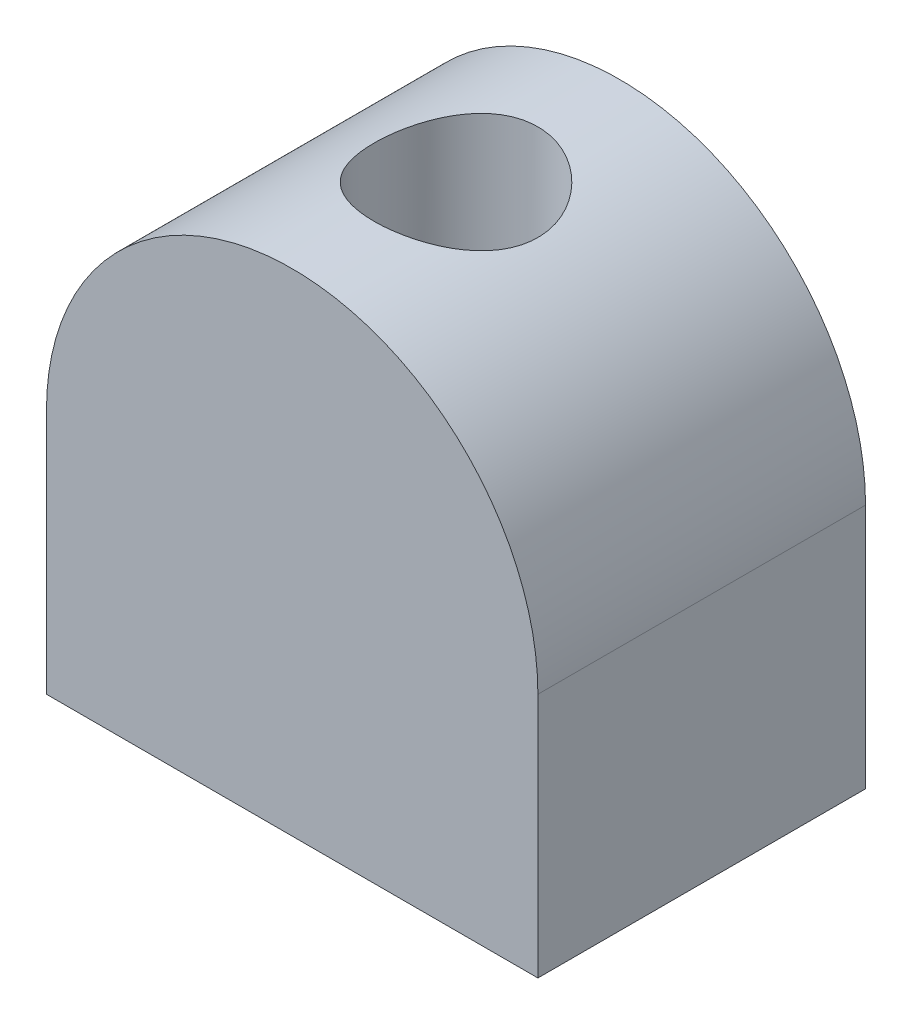
ISO-10303-21;
HEADER;
FILE_DESCRIPTION(('STEP AP214'),'2;1');
FILE_NAME('part.step','',(''),(''),'','','');
FILE_SCHEMA(('AUTOMOTIVE_DESIGN { 1 0 10303 214 1 1 1 1 }'));
ENDSEC;
DATA;
#1=APPLICATION_CONTEXT('core data for automotive mechanical design processes');
#2=APPLICATION_PROTOCOL_DEFINITION('international standard','automotive_design',2000,#1);
#3=PRODUCT_CONTEXT('',#1,'mechanical');
#4=PRODUCT('Part','Part','',(#3));
#5=PRODUCT_RELATED_PRODUCT_CATEGORY('part','',(#4));
#6=PRODUCT_DEFINITION_FORMATION('','',#4);
#7=PRODUCT_DEFINITION_CONTEXT('part definition',#1,'design');
#8=PRODUCT_DEFINITION('design','',#6,#7);
#9=PRODUCT_DEFINITION_SHAPE('','',#8);
#10=(LENGTH_UNIT() NAMED_UNIT(*) SI_UNIT(.MILLI.,.METRE.));
#11=(NAMED_UNIT(*) PLANE_ANGLE_UNIT() SI_UNIT($,.RADIAN.));
#12=(NAMED_UNIT(*) SI_UNIT($,.STERADIAN.) SOLID_ANGLE_UNIT());
#13=UNCERTAINTY_MEASURE_WITH_UNIT(LENGTH_MEASURE(1.E-05),#10,'distance_accuracy_value','');
#14=(GEOMETRIC_REPRESENTATION_CONTEXT(3) GLOBAL_UNCERTAINTY_ASSIGNED_CONTEXT((#13)) GLOBAL_UNIT_ASSIGNED_CONTEXT((#10,
#11,#12)) REPRESENTATION_CONTEXT('',''));
#15=CARTESIAN_POINT('',(0.,0.,0.));
#16=DIRECTION('',(0.,0.,1.));
#17=DIRECTION('',(1.,0.,0.));
#18=AXIS2_PLACEMENT_3D('',#15,#16,#17);
#19=CARTESIAN_POINT('',(15.,7.5,10.));
#20=DIRECTION('',(-1.,0.,0.));
#21=DIRECTION('',(0.,-1.,0.));
#22=AXIS2_PLACEMENT_3D('',#19,#20,#21);
#23=PLANE('',#22);
#24=DIRECTION('',(0.,1.,0.));
#25=VECTOR('',#24,1.);
#26=CARTESIAN_POINT('',(15.,7.5,-10.));
#27=LINE('',#26,#25);
#28=CARTESIAN_POINT('',(15.,-7.5,-10.));
#29=VERTEX_POINT('',#28);
#30=CARTESIAN_POINT('',(15.,7.5,-10.));
#31=VERTEX_POINT('',#30);
#32=EDGE_CURVE('E104',#29,#31,#27,.T.);
#33=ORIENTED_EDGE('',*,*,#32,.T.);
#34=DIRECTION('',(0.,0.,-1.));
#35=VECTOR('',#34,1.);
#36=CARTESIAN_POINT('',(15.,7.5,10.));
#37=LINE('',#36,#35);
#38=CARTESIAN_POINT('',(15.,7.5,10.));
#39=VERTEX_POINT('',#38);
#40=EDGE_CURVE('E46',#39,#31,#37,.T.);
#41=ORIENTED_EDGE('',*,*,#40,.F.);
#42=DIRECTION('',(0.,1.,0.));
#43=VECTOR('',#42,1.);
#44=CARTESIAN_POINT('',(15.,7.5,10.));
#45=LINE('',#44,#43);
#46=CARTESIAN_POINT('',(15.,-7.5,10.));
#47=VERTEX_POINT('',#46);
#48=EDGE_CURVE('E90',#47,#39,#45,.T.);
#49=ORIENTED_EDGE('',*,*,#48,.F.);
#50=DIRECTION('',(0.,0.,-1.));
#51=VECTOR('',#50,1.);
#52=CARTESIAN_POINT('',(15.,-7.5,10.));
#53=LINE('',#52,#51);
#54=EDGE_CURVE('E100',#47,#29,#53,.T.);
#55=ORIENTED_EDGE('',*,*,#54,.T.);
#56=EDGE_LOOP('',(#33,#41,#49,#55));
#57=FACE_BOUND('',#56,.T.);
#58=ADVANCED_FACE('F35',(#57),#23,.F.);
#59=CARTESIAN_POINT('',(0.,7.5,10.));
#60=DIRECTION('',(0.,0.,-1.));
#61=DIRECTION('',(-1.,0.,0.));
#62=AXIS2_PLACEMENT_3D('',#59,#60,#61);
#63=CYLINDRICAL_SURFACE('',#62,15.);
#64=CARTESIAN_POINT('',(0.,22.5,4.99999999999999));
#65=CARTESIAN_POINT('',(-0.27281681443361,22.5000007650471,5.00000126865821));
#66=CARTESIAN_POINT('',(-0.545625972692721,22.4924884753769,4.97759866936395));
#67=CARTESIAN_POINT('',(-1.08320880436489,22.4632605101644,4.88885445591386));
#68=CARTESIAN_POINT('',(-1.3479816405942,22.441543360109,4.82250828025523));
#69=CARTESIAN_POINT('',(-1.86166394750877,22.3862653953208,4.6484037830799));
#70=CARTESIAN_POINT('',(-2.11059912942976,22.3527243865376,4.5407146877042));
#71=CARTESIAN_POINT('',(-2.58687468402704,22.2772222858721,4.2872941358077));
#72=CARTESIAN_POINT('',(-2.81421078479507,22.2352595334076,4.14155517498489));
#73=CARTESIAN_POINT('',(-3.24870837510974,22.1457047221309,3.81087097570839));
#74=CARTESIAN_POINT('',(-3.45501850148552,22.0979778231161,3.62484382870571));
#75=CARTESIAN_POINT('',(-3.83416346351645,22.0030157392292,3.22116422645898));
#76=CARTESIAN_POINT('',(-4.00699092746984,21.9557806648007,3.00350482532686));
#77=CARTESIAN_POINT('',(-4.31912471111898,21.8656666235818,2.53507442404484));
#78=CARTESIAN_POINT('',(-4.45732429102251,21.8229519627198,2.28353130144921));
#79=CARTESIAN_POINT('',(-4.68909436930557,21.7487652698844,1.75911952782113));
#80=CARTESIAN_POINT('',(-4.78267848691247,21.7172898077928,1.48625741422144));
#81=CARTESIAN_POINT('',(-4.91936730756488,21.6705651637056,0.936633892488752));
#82=CARTESIAN_POINT('',(-4.96406724136036,21.6548047884339,0.660313957540239));
#83=CARTESIAN_POINT('',(-5.00670561667086,21.6397828315221,0.103681229235023));
#84=CARTESIAN_POINT('',(-5.00465850803658,21.6405161515599,-0.176630303515917));
#85=CARTESIAN_POINT('',(-4.95509951850356,21.6579507500054,-0.719683152261159));
#86=CARTESIAN_POINT('',(-4.90966956578087,21.6739207918415,-0.982642014718559));
#87=CARTESIAN_POINT('',(-4.77803081419366,21.7188328846856,-1.49696709815057));
#88=CARTESIAN_POINT('',(-4.69181713294738,21.7477764887883,-1.74833192720231));
#89=CARTESIAN_POINT('',(-4.47969529031768,21.8158955569848,-2.2370637479197));
#90=CARTESIAN_POINT('',(-4.35317024354077,21.8552282897692,-2.47414012733751));
#91=CARTESIAN_POINT('',(-4.06444553151122,21.9396279286729,-2.92435454140875));
#92=CARTESIAN_POINT('',(-3.9022355618188,21.9846964894921,-3.13748563466968));
#93=CARTESIAN_POINT('',(-3.53674666341247,22.0783664584198,-3.54545799080094));
#94=CARTESIAN_POINT('',(-3.3317657503819,22.1270294677509,-3.73876347254456));
#95=CARTESIAN_POINT('',(-2.89169784984997,22.2203469193431,-4.08865633331777));
#96=CARTESIAN_POINT('',(-2.65660797830397,22.265000976901,-4.24524019082269));
#97=CARTESIAN_POINT('',(-2.15973806523143,22.3458553968921,-4.51848150117513));
#98=CARTESIAN_POINT('',(-1.8977163820817,22.3819675004026,-4.6347274567036));
#99=CARTESIAN_POINT('',(-1.35634541682251,22.4410283572211,-4.82101586977861));
#100=CARTESIAN_POINT('',(-1.07700219077476,22.4639816827438,-4.8910743771172));
#101=CARTESIAN_POINT('',(-0.521919147646521,22.4933813535722,-4.98027833011178));
#102=CARTESIAN_POINT('',(-0.246547999324228,22.5005000916864,-5.00149904586375));
#103=CARTESIAN_POINT('',(0.303875349801193,22.4994451347413,-4.99833663200766));
#104=CARTESIAN_POINT('',(0.578927596598257,22.4912740209681,-4.97396120010061));
#105=CARTESIAN_POINT('',(1.11259933152128,22.4610012358552,-4.8819404613202));
#106=CARTESIAN_POINT('',(1.37146403417422,22.4393099355596,-4.81556896975252));
#107=CARTESIAN_POINT('',(1.87427979289787,22.3845923415035,-4.64303277766635));
#108=CARTESIAN_POINT('',(2.11822894254303,22.3515646023337,-4.53686300266107));
#109=CARTESIAN_POINT('',(2.59144148196637,22.2764465643645,-4.28464784079606));
#110=CARTESIAN_POINT('',(2.82014979608573,22.2341407377893,-4.13762703358414));
#111=CARTESIAN_POINT('',(3.25032415067793,22.1452626958131,-3.80902924993258));
#112=CARTESIAN_POINT('',(3.45178183897788,22.0986891796914,-3.62744171984117));
#113=CARTESIAN_POINT('',(3.8312625390315,22.0038423990222,-3.22510624496705));
#114=CARTESIAN_POINT('',(4.00780484622885,21.9555880543714,-3.00295386536569));
#115=CARTESIAN_POINT('',(4.32128761161787,21.8649986647354,-2.53114216094556));
#116=CARTESIAN_POINT('',(4.45822773965506,21.8226636691001,-2.28148260682961));
#117=CARTESIAN_POINT('',(4.6879846520818,21.7491195895692,-1.76163492355051));
#118=CARTESIAN_POINT('',(4.7808906608251,21.7178880396489,-1.49148960415617));
#119=CARTESIAN_POINT('',(4.91947333379677,21.6705416153225,-0.938106749779342));
#120=CARTESIAN_POINT('',(4.96517127476969,21.654419931182,-0.654875172978247));
#121=CARTESIAN_POINT('',(5.00638141238671,21.6398929437089,-0.0990145197954147));
#122=CARTESIAN_POINT('',(5.00435128654199,21.6406200128708,0.173411701434119));
#123=CARTESIAN_POINT('',(4.95621146724346,21.6575634911934,0.713825374610315));
#124=CARTESIAN_POINT('',(4.91010439729292,21.6737789784681,0.981813089775445));
#125=CARTESIAN_POINT('',(4.77685906564672,21.7192262152446,1.50067831501236));
#126=CARTESIAN_POINT('',(4.69051673007756,21.7482049011239,1.75178412502249));
#127=CARTESIAN_POINT('',(4.47989682879873,21.8158199409234,2.23613703469135));
#128=CARTESIAN_POINT('',(4.35561084276902,21.8544584381697,2.46938015594004));
#129=CARTESIAN_POINT('',(4.06630346291714,21.9391414613023,2.92241834961456));
#130=CARTESIAN_POINT('',(3.8997412138229,21.9854355821069,3.14118250949193));
#131=CARTESIAN_POINT('',(3.53321441567824,22.0791678141626,3.548449066921));
#132=CARTESIAN_POINT('',(3.3332404222574,22.1266062456186,3.73694287844037));
#133=CARTESIAN_POINT('',(2.89620778460343,22.2195015262772,4.08572206144589));
#134=CARTESIAN_POINT('',(2.65800756749864,22.2648090900628,4.244621738755));
#135=CARTESIAN_POINT('',(2.15678678703312,22.3462995586306,4.51995214425323));
#136=CARTESIAN_POINT('',(1.89377259066174,22.3824847953965,4.63639372961021));
#137=CARTESIAN_POINT('',(1.36246823600487,22.4402757534271,4.81860816244336));
#138=CARTESIAN_POINT('',(1.09493878838204,22.4624606211261,4.88641233131688));
#139=CARTESIAN_POINT('',(0.55160208005123,22.4923203532111,4.97710140338562));
#140=CARTESIAN_POINT('',(0.275797127843722,22.4999992265953,4.99999871748267));
#141=CARTESIAN_POINT('',(0.,22.5,4.99999999999999));
#142=B_SPLINE_CURVE_WITH_KNOTS('',3,(#64,#65,#66,#67,#68,#69,#70,#71,#72,#73,#74,#75,#76,#77,
#78,#79,#80,#81,#82,#83,#84,#85,#86,#87,#88,#89,#90,#91,#92,#93,#94,#95,#96,#97,#98,#99,#100,
#101,#102,#103,#104,#105,#106,#107,#108,#109,#110,#111,#112,#113,#114,#115,#116,#117,#118,#119,
#120,#121,#122,#123,#124,#125,#126,#127,#128,#129,#130,#131,#132,#133,#134,#135,#136,#137,#138,
#139,#140,#141),.UNSPECIFIED.,.T.,.F.,(4,2,2,2,2,2,2,2,2,2,2,2,2,2,2,2,2,2,2,2,2,2,2,2,2,2,2,2,
2,2,2,2,2,2,2,2,2,2,4),(0.,0.817435530130054,1.6349559263376,2.45111336435137,3.2674318889955,
4.1092342141378,4.95122166437651,5.8174192411892,6.68335223467749,7.52009628712783,
8.35658169941009,9.15484132763712,9.9531965428806,10.764408557863,11.5758551280169,
12.4296652906748,13.2835572984374,14.1459202826244,15.0079834439669,15.832679158865,
16.6572356583153,17.4579078990172,18.2586822643117,19.0805199922933,19.902609041201,
20.7620511441441,21.6215004118563,22.479200691445,23.3365142353985,24.1497833033194,
24.9630039676752,25.7607793541274,26.5587319089054,27.3915033346967,28.2245105562954,
29.0899830418615,29.9552340577293,30.7818279187971,31.6081933020135),.UNSPECIFIED.);
#143=CARTESIAN_POINT('',(0.,22.5,4.99999999999999));
#144=VERTEX_POINT('',#143);
#145=EDGE_CURVE('E11',#144,#144,#142,.T.);
#146=ORIENTED_EDGE('',*,*,#145,.T.);
#147=EDGE_LOOP('',(#146));
#148=FACE_BOUND('',#147,.T.);
#149=CARTESIAN_POINT('',(0.,7.5,-10.));
#150=DIRECTION('',(0.,0.,1.));
#151=DIRECTION('',(1.,0.,0.));
#152=AXIS2_PLACEMENT_3D('',#149,#150,#151);
#153=CIRCLE('',#152,15.);
#154=CARTESIAN_POINT('',(-15.,7.5,-10.));
#155=VERTEX_POINT('',#154);
#156=EDGE_CURVE('E95',#31,#155,#153,.T.);
#157=ORIENTED_EDGE('',*,*,#156,.T.);
#158=DIRECTION('',(0.,0.,-1.));
#159=VECTOR('',#158,1.);
#160=CARTESIAN_POINT('',(-15.,7.5,10.));
#161=LINE('',#160,#159);
#162=CARTESIAN_POINT('',(-15.,7.5,10.));
#163=VERTEX_POINT('',#162);
#164=EDGE_CURVE('E93',#163,#155,#161,.T.);
#165=ORIENTED_EDGE('',*,*,#164,.F.);
#166=CARTESIAN_POINT('',(0.,7.5,10.));
#167=DIRECTION('',(0.,0.,1.));
#168=DIRECTION('',(1.,0.,0.));
#169=AXIS2_PLACEMENT_3D('',#166,#167,#168);
#170=CIRCLE('',#169,15.);
#171=EDGE_CURVE('E85',#39,#163,#170,.T.);
#172=ORIENTED_EDGE('',*,*,#171,.F.);
#173=ORIENTED_EDGE('',*,*,#40,.T.);
#174=EDGE_LOOP('',(#157,#165,#172,#173));
#175=FACE_BOUND('',#174,.T.);
#176=ADVANCED_FACE('F94',(#148,#175),#63,.T.);
#177=CARTESIAN_POINT('',(-15.,7.5,10.));
#178=DIRECTION('',(1.,0.,0.));
#179=DIRECTION('',(0.,1.,0.));
#180=AXIS2_PLACEMENT_3D('',#177,#178,#179);
#181=PLANE('',#180);
#182=DIRECTION('',(0.,-1.,0.));
#183=VECTOR('',#182,1.);
#184=CARTESIAN_POINT('',(-15.,7.5,-10.));
#185=LINE('',#184,#183);
#186=CARTESIAN_POINT('',(-15.,-7.5,-10.));
#187=VERTEX_POINT('',#186);
#188=EDGE_CURVE('E71',#155,#187,#185,.T.);
#189=ORIENTED_EDGE('',*,*,#188,.T.);
#190=DIRECTION('',(0.,0.,-1.));
#191=VECTOR('',#190,1.);
#192=CARTESIAN_POINT('',(-15.,-7.5,10.));
#193=LINE('',#192,#191);
#194=CARTESIAN_POINT('',(-15.,-7.5,10.));
#195=VERTEX_POINT('',#194);
#196=EDGE_CURVE('E96',#195,#187,#193,.T.);
#197=ORIENTED_EDGE('',*,*,#196,.F.);
#198=DIRECTION('',(0.,-1.,0.));
#199=VECTOR('',#198,1.);
#200=CARTESIAN_POINT('',(-15.,7.5,10.));
#201=LINE('',#200,#199);
#202=EDGE_CURVE('E88',#163,#195,#201,.T.);
#203=ORIENTED_EDGE('',*,*,#202,.F.);
#204=ORIENTED_EDGE('',*,*,#164,.T.);
#205=EDGE_LOOP('',(#189,#197,#203,#204));
#206=FACE_BOUND('',#205,.T.);
#207=ADVANCED_FACE('F98',(#206),#181,.F.);
#208=CARTESIAN_POINT('',(-15.,-7.5,10.));
#209=DIRECTION('',(0.,1.,0.));
#210=DIRECTION('',(0.,0.,1.));
#211=AXIS2_PLACEMENT_3D('',#208,#209,#210);
#212=PLANE('',#211);
#213=CARTESIAN_POINT('',(0.,-7.5,0.));
#214=DIRECTION('',(0.,1.,0.));
#215=DIRECTION('',(0.,0.,1.));
#216=AXIS2_PLACEMENT_3D('',#213,#214,#215);
#217=CIRCLE('',#216,2.74999999999999);
#218=CARTESIAN_POINT('',(0.,-7.5,2.74999999999999));
#219=VERTEX_POINT('',#218);
#220=EDGE_CURVE('E107',#219,#219,#217,.T.);
#221=ORIENTED_EDGE('',*,*,#220,.T.);
#222=EDGE_LOOP('',(#221));
#223=FACE_BOUND('',#222,.T.);
#224=DIRECTION('',(1.,0.,0.));
#225=VECTOR('',#224,1.);
#226=CARTESIAN_POINT('',(-15.,-7.5,-10.));
#227=LINE('',#226,#225);
#228=EDGE_CURVE('E77',#187,#29,#227,.T.);
#229=ORIENTED_EDGE('',*,*,#228,.T.);
#230=ORIENTED_EDGE('',*,*,#54,.F.);
#231=DIRECTION('',(1.,0.,0.));
#232=VECTOR('',#231,1.);
#233=CARTESIAN_POINT('',(-15.,-7.5,10.));
#234=LINE('',#233,#232);
#235=EDGE_CURVE('E54',#195,#47,#234,.T.);
#236=ORIENTED_EDGE('',*,*,#235,.F.);
#237=ORIENTED_EDGE('',*,*,#196,.T.);
#238=EDGE_LOOP('',(#229,#230,#236,#237));
#239=FACE_BOUND('',#238,.T.);
#240=ADVANCED_FACE('F125',(#223,#239),#212,.F.);
#241=CARTESIAN_POINT('',(0.,7.5,10.));
#242=DIRECTION('',(0.,0.,1.));
#243=DIRECTION('',(1.,0.,0.));
#244=AXIS2_PLACEMENT_3D('',#241,#242,#243);
#245=PLANE('',#244);
#246=ORIENTED_EDGE('',*,*,#48,.T.);
#247=ORIENTED_EDGE('',*,*,#171,.T.);
#248=ORIENTED_EDGE('',*,*,#202,.T.);
#249=ORIENTED_EDGE('',*,*,#235,.T.);
#250=EDGE_LOOP('',(#246,#247,#248,#249));
#251=FACE_BOUND('',#250,.T.);
#252=ADVANCED_FACE('F86',(#251),#245,.T.);
#253=CARTESIAN_POINT('',(0.,7.5,-10.));
#254=DIRECTION('',(0.,0.,1.));
#255=DIRECTION('',(1.,0.,0.));
#256=AXIS2_PLACEMENT_3D('',#253,#254,#255);
#257=PLANE('',#256);
#258=ORIENTED_EDGE('',*,*,#32,.F.);
#259=ORIENTED_EDGE('',*,*,#228,.F.);
#260=ORIENTED_EDGE('',*,*,#188,.F.);
#261=ORIENTED_EDGE('',*,*,#156,.F.);
#262=EDGE_LOOP('',(#258,#259,#260,#261));
#263=FACE_BOUND('',#262,.T.);
#264=ADVANCED_FACE('F115',(#263),#257,.F.);
#265=CARTESIAN_POINT('',(0.,22.5,0.));
#266=DIRECTION('',(0.,1.,0.));
#267=DIRECTION('',(0.,0.,1.));
#268=AXIS2_PLACEMENT_3D('',#265,#266,#267);
#269=CYLINDRICAL_SURFACE('',#268,4.99999999999999);
#270=CARTESIAN_POINT('',(0.,14.5,0.));
#271=DIRECTION('',(0.,1.,0.));
#272=DIRECTION('',(0.,0.,1.));
#273=AXIS2_PLACEMENT_3D('',#270,#271,#272);
#274=CIRCLE('',#273,5.);
#275=CARTESIAN_POINT('',(0.,14.5,5.));
#276=VERTEX_POINT('',#275);
#277=EDGE_CURVE('E148',#276,#276,#274,.T.);
#278=ORIENTED_EDGE('',*,*,#277,.F.);
#279=EDGE_LOOP('',(#278));
#280=FACE_BOUND('',#279,.T.);
#281=ORIENTED_EDGE('',*,*,#145,.F.);
#282=EDGE_LOOP('',(#281));
#283=FACE_BOUND('',#282,.T.);
#284=ADVANCED_FACE('F117',(#280,#283),#269,.F.);
#285=CARTESIAN_POINT('',(0.,22.5,0.));
#286=DIRECTION('',(0.,1.,0.));
#287=DIRECTION('',(0.,0.,1.));
#288=AXIS2_PLACEMENT_3D('',#285,#286,#287);
#289=CYLINDRICAL_SURFACE('',#288,2.75);
#290=ORIENTED_EDGE('',*,*,#220,.F.);
#291=EDGE_LOOP('',(#290));
#292=FACE_BOUND('',#291,.T.);
#293=CARTESIAN_POINT('',(0.,14.5,0.));
#294=DIRECTION('',(0.,1.,0.));
#295=DIRECTION('',(0.,0.,1.));
#296=AXIS2_PLACEMENT_3D('',#293,#294,#295);
#297=CIRCLE('',#296,2.75);
#298=CARTESIAN_POINT('',(0.,14.5,2.75));
#299=VERTEX_POINT('',#298);
#300=EDGE_CURVE('E145',#299,#299,#297,.T.);
#301=ORIENTED_EDGE('',*,*,#300,.T.);
#302=EDGE_LOOP('',(#301));
#303=FACE_BOUND('',#302,.T.);
#304=ADVANCED_FACE('F123',(#292,#303),#289,.F.);
#305=CARTESIAN_POINT('',(2.75,14.5,0.));
#306=DIRECTION('',(0.,-1.,0.));
#307=DIRECTION('',(0.,0.,-1.));
#308=AXIS2_PLACEMENT_3D('',#305,#306,#307);
#309=PLANE('',#308);
#310=ORIENTED_EDGE('',*,*,#300,.F.);
#311=EDGE_LOOP('',(#310));
#312=FACE_BOUND('',#311,.T.);
#313=ORIENTED_EDGE('',*,*,#277,.T.);
#314=EDGE_LOOP('',(#313));
#315=FACE_BOUND('',#314,.T.);
#316=ADVANCED_FACE('F154',(#312,#315),#309,.F.);
#317=CLOSED_SHELL('',(#58,#176,#207,#240,#252,#264,#284,#304,#316));
#318=MANIFOLD_SOLID_BREP('B2',#317);
#319=ADVANCED_BREP_SHAPE_REPRESENTATION('',(#18,#318),#14);
#320=SHAPE_DEFINITION_REPRESENTATION(#9,#319);
ENDSEC;
END-ISO-10303-21;
